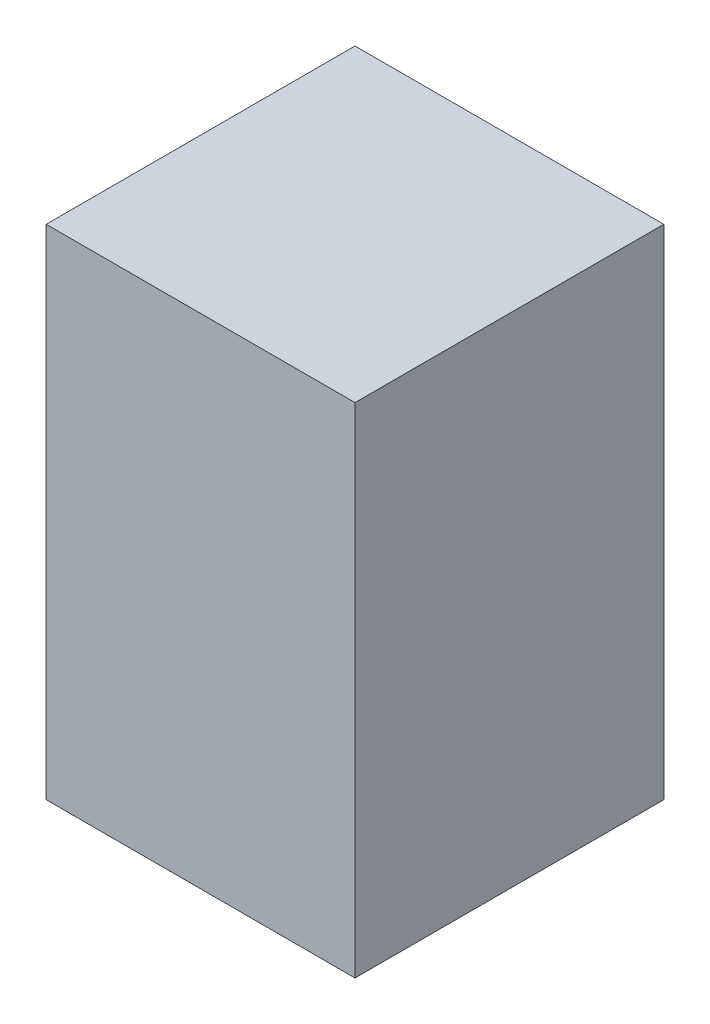
ISO-10303-21;
HEADER;
FILE_DESCRIPTION(('STEP AP214'),'2;1');
FILE_NAME('part.step','',(''),(''),'','','');
FILE_SCHEMA(('AUTOMOTIVE_DESIGN { 1 0 10303 214 1 1 1 1 }'));
ENDSEC;
DATA;
#1=APPLICATION_CONTEXT('core data for automotive mechanical design processes');
#2=APPLICATION_PROTOCOL_DEFINITION('international standard','automotive_design',2000,#1);
#3=PRODUCT_CONTEXT('',#1,'mechanical');
#4=PRODUCT('Part','Part','',(#3));
#5=PRODUCT_RELATED_PRODUCT_CATEGORY('part','',(#4));
#6=PRODUCT_DEFINITION_FORMATION('','',#4);
#7=PRODUCT_DEFINITION_CONTEXT('part definition',#1,'design');
#8=PRODUCT_DEFINITION('design','',#6,#7);
#9=PRODUCT_DEFINITION_SHAPE('','',#8);
#10=(LENGTH_UNIT() NAMED_UNIT(*) SI_UNIT(.MILLI.,.METRE.));
#11=(NAMED_UNIT(*) PLANE_ANGLE_UNIT() SI_UNIT($,.RADIAN.));
#12=(NAMED_UNIT(*) SI_UNIT($,.STERADIAN.) SOLID_ANGLE_UNIT());
#13=UNCERTAINTY_MEASURE_WITH_UNIT(LENGTH_MEASURE(1.E-05),#10,'distance_accuracy_value','');
#14=(GEOMETRIC_REPRESENTATION_CONTEXT(3) GLOBAL_UNCERTAINTY_ASSIGNED_CONTEXT((#13)) GLOBAL_UNIT_ASSIGNED_CONTEXT((#10,
#11,#12)) REPRESENTATION_CONTEXT('',''));
#15=CARTESIAN_POINT('',(0.,0.,0.));
#16=DIRECTION('',(0.,0.,1.));
#17=DIRECTION('',(1.,0.,0.));
#18=AXIS2_PLACEMENT_3D('',#15,#16,#17);
#19=CARTESIAN_POINT('',(21.1,68.1,21.1));
#20=DIRECTION('',(-1.,0.,0.));
#21=DIRECTION('',(0.,0.,1.));
#22=AXIS2_PLACEMENT_3D('',#19,#20,#21);
#23=PLANE('',#22);
#24=DIRECTION('',(0.,0.,-1.));
#25=VECTOR('',#24,1.);
#26=CARTESIAN_POINT('',(21.1,0.,21.1));
#27=LINE('',#26,#25);
#28=CARTESIAN_POINT('',(21.1,0.,21.1));
#29=VERTEX_POINT('',#28);
#30=CARTESIAN_POINT('',(21.1,0.,-21.1));
#31=VERTEX_POINT('',#30);
#32=EDGE_CURVE('E102',#29,#31,#27,.T.);
#33=ORIENTED_EDGE('',*,*,#32,.T.);
#34=DIRECTION('',(0.,-1.,0.));
#35=VECTOR('',#34,1.);
#36=CARTESIAN_POINT('',(21.1,68.1,-21.1));
#37=LINE('',#36,#35);
#38=CARTESIAN_POINT('',(21.1,68.1,-21.1));
#39=VERTEX_POINT('',#38);
#40=EDGE_CURVE('E39',#39,#31,#37,.T.);
#41=ORIENTED_EDGE('',*,*,#40,.F.);
#42=DIRECTION('',(0.,0.,-1.));
#43=VECTOR('',#42,1.);
#44=CARTESIAN_POINT('',(21.1,68.1,21.1));
#45=LINE('',#44,#43);
#46=CARTESIAN_POINT('',(21.1,68.1,21.1));
#47=VERTEX_POINT('',#46);
#48=EDGE_CURVE('E89',#47,#39,#45,.T.);
#49=ORIENTED_EDGE('',*,*,#48,.F.);
#50=DIRECTION('',(0.,-1.,0.));
#51=VECTOR('',#50,1.);
#52=CARTESIAN_POINT('',(21.1,68.1,21.1));
#53=LINE('',#52,#51);
#54=EDGE_CURVE('E98',#47,#29,#53,.T.);
#55=ORIENTED_EDGE('',*,*,#54,.T.);
#56=EDGE_LOOP('',(#33,#41,#49,#55));
#57=FACE_BOUND('',#56,.T.);
#58=ADVANCED_FACE('F36',(#57),#23,.F.);
#59=CARTESIAN_POINT('',(-21.1,68.1,-21.1));
#60=DIRECTION('',(0.,0.,1.));
#61=DIRECTION('',(1.,0.,0.));
#62=AXIS2_PLACEMENT_3D('',#59,#60,#61);
#63=PLANE('',#62);
#64=DIRECTION('',(-1.,0.,0.));
#65=VECTOR('',#64,1.);
#66=CARTESIAN_POINT('',(-21.1,0.,-21.1));
#67=LINE('',#66,#65);
#68=CARTESIAN_POINT('',(-21.1,0.,-21.1));
#69=VERTEX_POINT('',#68);
#70=EDGE_CURVE('E94',#31,#69,#67,.T.);
#71=ORIENTED_EDGE('',*,*,#70,.T.);
#72=DIRECTION('',(0.,-1.,0.));
#73=VECTOR('',#72,1.);
#74=CARTESIAN_POINT('',(-21.1,68.1,-21.1));
#75=LINE('',#74,#73);
#76=CARTESIAN_POINT('',(-21.1,68.1,-21.1));
#77=VERTEX_POINT('',#76);
#78=EDGE_CURVE('E92',#77,#69,#75,.T.);
#79=ORIENTED_EDGE('',*,*,#78,.F.);
#80=DIRECTION('',(-1.,0.,0.));
#81=VECTOR('',#80,1.);
#82=CARTESIAN_POINT('',(-21.1,68.1,-21.1));
#83=LINE('',#82,#81);
#84=EDGE_CURVE('E84',#39,#77,#83,.T.);
#85=ORIENTED_EDGE('',*,*,#84,.F.);
#86=ORIENTED_EDGE('',*,*,#40,.T.);
#87=EDGE_LOOP('',(#71,#79,#85,#86));
#88=FACE_BOUND('',#87,.T.);
#89=ADVANCED_FACE('F93',(#88),#63,.F.);
#90=CARTESIAN_POINT('',(-21.1,68.1,21.1));
#91=DIRECTION('',(1.,0.,0.));
#92=DIRECTION('',(0.,0.,-1.));
#93=AXIS2_PLACEMENT_3D('',#90,#91,#92);
#94=PLANE('',#93);
#95=DIRECTION('',(0.,0.,1.));
#96=VECTOR('',#95,1.);
#97=CARTESIAN_POINT('',(-21.1,0.,21.1));
#98=LINE('',#97,#96);
#99=CARTESIAN_POINT('',(-21.1,0.,21.1));
#100=VERTEX_POINT('',#99);
#101=EDGE_CURVE('E70',#69,#100,#98,.T.);
#102=ORIENTED_EDGE('',*,*,#101,.T.);
#103=DIRECTION('',(0.,-1.,0.));
#104=VECTOR('',#103,1.);
#105=CARTESIAN_POINT('',(-21.1,68.1,21.1));
#106=LINE('',#105,#104);
#107=CARTESIAN_POINT('',(-21.1,68.1,21.1));
#108=VERTEX_POINT('',#107);
#109=EDGE_CURVE('E95',#108,#100,#106,.T.);
#110=ORIENTED_EDGE('',*,*,#109,.F.);
#111=DIRECTION('',(0.,0.,1.));
#112=VECTOR('',#111,1.);
#113=CARTESIAN_POINT('',(-21.1,68.1,21.1));
#114=LINE('',#113,#112);
#115=EDGE_CURVE('E87',#77,#108,#114,.T.);
#116=ORIENTED_EDGE('',*,*,#115,.F.);
#117=ORIENTED_EDGE('',*,*,#78,.T.);
#118=EDGE_LOOP('',(#102,#110,#116,#117));
#119=FACE_BOUND('',#118,.T.);
#120=ADVANCED_FACE('F96',(#119),#94,.F.);
#121=CARTESIAN_POINT('',(-21.1,68.1,21.1));
#122=DIRECTION('',(0.,0.,-1.));
#123=DIRECTION('',(-1.,0.,0.));
#124=AXIS2_PLACEMENT_3D('',#121,#122,#123);
#125=PLANE('',#124);
#126=DIRECTION('',(1.,0.,0.));
#127=VECTOR('',#126,1.);
#128=CARTESIAN_POINT('',(-21.1,0.,21.1));
#129=LINE('',#128,#127);
#130=EDGE_CURVE('E76',#100,#29,#129,.T.);
#131=ORIENTED_EDGE('',*,*,#130,.T.);
#132=ORIENTED_EDGE('',*,*,#54,.F.);
#133=DIRECTION('',(1.,0.,0.));
#134=VECTOR('',#133,1.);
#135=CARTESIAN_POINT('',(-21.1,68.1,21.1));
#136=LINE('',#135,#134);
#137=EDGE_CURVE('E53',#108,#47,#136,.T.);
#138=ORIENTED_EDGE('',*,*,#137,.F.);
#139=ORIENTED_EDGE('',*,*,#109,.T.);
#140=EDGE_LOOP('',(#131,#132,#138,#139));
#141=FACE_BOUND('',#140,.T.);
#142=ADVANCED_FACE('F110',(#141),#125,.F.);
#143=CARTESIAN_POINT('',(0.,68.1,0.));
#144=DIRECTION('',(0.,-1.,0.));
#145=DIRECTION('',(0.,0.,-1.));
#146=AXIS2_PLACEMENT_3D('',#143,#144,#145);
#147=PLANE('',#146);
#148=ORIENTED_EDGE('',*,*,#48,.T.);
#149=ORIENTED_EDGE('',*,*,#84,.T.);
#150=ORIENTED_EDGE('',*,*,#115,.T.);
#151=ORIENTED_EDGE('',*,*,#137,.T.);
#152=EDGE_LOOP('',(#148,#149,#150,#151));
#153=FACE_BOUND('',#152,.T.);
#154=ADVANCED_FACE('F85',(#153),#147,.F.);
#155=CARTESIAN_POINT('',(0.,0.,0.));
#156=DIRECTION('',(0.,-1.,0.));
#157=DIRECTION('',(0.,0.,-1.));
#158=AXIS2_PLACEMENT_3D('',#155,#156,#157);
#159=PLANE('',#158);
#160=CARTESIAN_POINT('',(0.,0.,0.));
#161=DIRECTION('',(0.,-1.,0.));
#162=DIRECTION('',(0.,0.,-1.));
#163=AXIS2_PLACEMENT_3D('',#160,#161,#162);
#164=CIRCLE('',#163,11.);
#165=CARTESIAN_POINT('',(0.,0.,-11.));
#166=VERTEX_POINT('',#165);
#167=EDGE_CURVE('E11',#166,#166,#164,.T.);
#168=ORIENTED_EDGE('',*,*,#167,.F.);
#169=EDGE_LOOP('',(#168));
#170=FACE_BOUND('',#169,.T.);
#171=ORIENTED_EDGE('',*,*,#32,.F.);
#172=ORIENTED_EDGE('',*,*,#130,.F.);
#173=ORIENTED_EDGE('',*,*,#101,.F.);
#174=ORIENTED_EDGE('',*,*,#70,.F.);
#175=EDGE_LOOP('',(#171,#172,#173,#174));
#176=FACE_BOUND('',#175,.T.);
#177=ADVANCED_FACE('F113',(#170,#176),#159,.T.);
#178=CARTESIAN_POINT('',(0.,-1.8,0.));
#179=DIRECTION('',(0.,1.,0.));
#180=DIRECTION('',(0.,0.,1.));
#181=AXIS2_PLACEMENT_3D('',#178,#179,#180);
#182=CYLINDRICAL_SURFACE('',#181,11.);
#183=CARTESIAN_POINT('',(0.,-1.8,0.));
#184=DIRECTION('',(0.,-1.,0.));
#185=DIRECTION('',(0.,0.,-1.));
#186=AXIS2_PLACEMENT_3D('',#183,#184,#185);
#187=CIRCLE('',#186,11.);
#188=CARTESIAN_POINT('',(0.,-1.8,-11.));
#189=VERTEX_POINT('',#188);
#190=EDGE_CURVE('E105',#189,#189,#187,.T.);
#191=ORIENTED_EDGE('',*,*,#190,.F.);
#192=EDGE_LOOP('',(#191));
#193=FACE_BOUND('',#192,.T.);
#194=ORIENTED_EDGE('',*,*,#167,.T.);
#195=EDGE_LOOP('',(#194));
#196=FACE_BOUND('',#195,.T.);
#197=ADVANCED_FACE('F121',(#193,#196),#182,.T.);
#198=CARTESIAN_POINT('',(0.,-1.8,0.));
#199=DIRECTION('',(0.,-1.,0.));
#200=DIRECTION('',(0.,0.,-1.));
#201=AXIS2_PLACEMENT_3D('',#198,#199,#200);
#202=PLANE('',#201);
#203=ORIENTED_EDGE('',*,*,#190,.T.);
#204=EDGE_LOOP('',(#203));
#205=FACE_BOUND('',#204,.T.);
#206=ADVANCED_FACE('F119',(#205),#202,.T.);
#207=CLOSED_SHELL('',(#58,#89,#120,#142,#154,#177,#197,#206));
#208=MANIFOLD_SOLID_BREP('B2',#207);
#209=ADVANCED_BREP_SHAPE_REPRESENTATION('',(#18,#208),#14);
#210=SHAPE_DEFINITION_REPRESENTATION(#9,#209);
ENDSEC;
END-ISO-10303-21;
